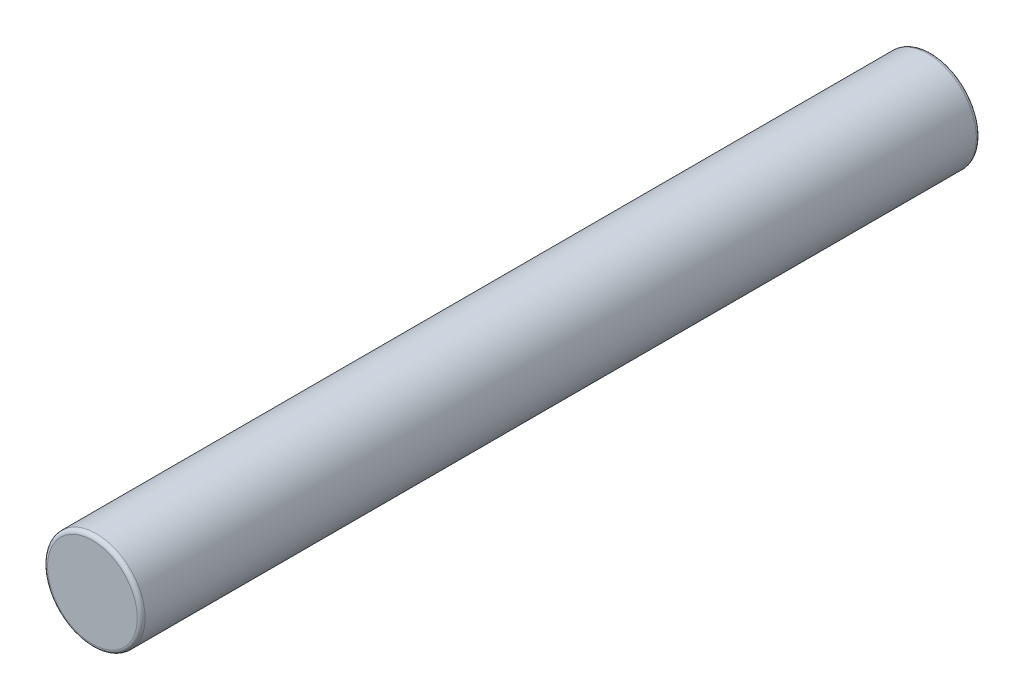
ISO-10303-21;
HEADER;
FILE_DESCRIPTION(('STEP AP214'),'2;1');
FILE_NAME('part.step','',(''),(''),'','','');
FILE_SCHEMA(('AUTOMOTIVE_DESIGN { 1 0 10303 214 1 1 1 1 }'));
ENDSEC;
DATA;
#1=APPLICATION_CONTEXT('core data for automotive mechanical design processes');
#2=APPLICATION_PROTOCOL_DEFINITION('international standard','automotive_design',2000,#1);
#3=PRODUCT_CONTEXT('',#1,'mechanical');
#4=PRODUCT('Part','Part','',(#3));
#5=PRODUCT_RELATED_PRODUCT_CATEGORY('part','',(#4));
#6=PRODUCT_DEFINITION_FORMATION('','',#4);
#7=PRODUCT_DEFINITION_CONTEXT('part definition',#1,'design');
#8=PRODUCT_DEFINITION('design','',#6,#7);
#9=PRODUCT_DEFINITION_SHAPE('','',#8);
#10=(LENGTH_UNIT() NAMED_UNIT(*) SI_UNIT(.MILLI.,.METRE.));
#11=(NAMED_UNIT(*) PLANE_ANGLE_UNIT() SI_UNIT($,.RADIAN.));
#12=(NAMED_UNIT(*) SI_UNIT($,.STERADIAN.) SOLID_ANGLE_UNIT());
#13=UNCERTAINTY_MEASURE_WITH_UNIT(LENGTH_MEASURE(1.E-05),#10,'distance_accuracy_value','');
#14=(GEOMETRIC_REPRESENTATION_CONTEXT(3) GLOBAL_UNCERTAINTY_ASSIGNED_CONTEXT((#13)) GLOBAL_UNIT_ASSIGNED_CONTEXT((#10,
#11,#12)) REPRESENTATION_CONTEXT('',''));
#15=CARTESIAN_POINT('',(0.,0.,0.));
#16=DIRECTION('',(0.,0.,1.));
#17=DIRECTION('',(1.,0.,0.));
#18=AXIS2_PLACEMENT_3D('',#15,#16,#17);
#19=CARTESIAN_POINT('',(0.,0.,21.5));
#20=DIRECTION('',(0.,0.,-1.));
#21=DIRECTION('',(-1.,0.,0.));
#22=AXIS2_PLACEMENT_3D('',#19,#20,#21);
#23=CYLINDRICAL_SURFACE('',#22,2.5);
#24=CARTESIAN_POINT('',(0.,0.,-21.3));
#25=DIRECTION('',(0.,0.,1.));
#26=DIRECTION('',(1.,0.,0.));
#27=AXIS2_PLACEMENT_3D('',#24,#25,#26);
#28=CIRCLE('',#27,2.5);
#29=CARTESIAN_POINT('',(2.5,0.,-21.3));
#30=VERTEX_POINT('',#29);
#31=EDGE_CURVE('E43',#30,#30,#28,.T.);
#32=ORIENTED_EDGE('',*,*,#31,.T.);
#33=EDGE_LOOP('',(#32));
#34=FACE_BOUND('',#33,.T.);
#35=CARTESIAN_POINT('',(0.,0.,21.3));
#36=DIRECTION('',(0.,0.,1.));
#37=DIRECTION('',(1.,0.,0.));
#38=AXIS2_PLACEMENT_3D('',#35,#36,#37);
#39=CIRCLE('',#38,2.5);
#40=CARTESIAN_POINT('',(2.5,0.,21.3));
#41=VERTEX_POINT('',#40);
#42=EDGE_CURVE('E47',#41,#41,#39,.F.);
#43=ORIENTED_EDGE('',*,*,#42,.T.);
#44=EDGE_LOOP('',(#43));
#45=FACE_BOUND('',#44,.T.);
#46=ADVANCED_FACE('F33',(#34,#45),#23,.T.);
#47=CARTESIAN_POINT('',(0.,0.,21.5));
#48=DIRECTION('',(0.,0.,1.));
#49=DIRECTION('',(1.,0.,0.));
#50=AXIS2_PLACEMENT_3D('',#47,#48,#49);
#51=PLANE('',#50);
#52=CARTESIAN_POINT('',(0.,0.,21.5));
#53=DIRECTION('',(0.,0.,1.));
#54=DIRECTION('',(1.,0.,0.));
#55=AXIS2_PLACEMENT_3D('',#52,#53,#54);
#56=CIRCLE('',#55,2.3);
#57=CARTESIAN_POINT('',(2.3,0.,21.5));
#58=VERTEX_POINT('',#57);
#59=EDGE_CURVE('E10',#58,#58,#56,.T.);
#60=ORIENTED_EDGE('',*,*,#59,.T.);
#61=EDGE_LOOP('',(#60));
#62=FACE_BOUND('',#61,.T.);
#63=ADVANCED_FACE('F66',(#62),#51,.T.);
#64=CARTESIAN_POINT('',(0.,0.,-21.5));
#65=DIRECTION('',(0.,0.,1.));
#66=DIRECTION('',(1.,0.,0.));
#67=AXIS2_PLACEMENT_3D('',#64,#65,#66);
#68=PLANE('',#67);
#69=CARTESIAN_POINT('',(0.,0.,-21.5));
#70=DIRECTION('',(0.,0.,1.));
#71=DIRECTION('',(1.,0.,0.));
#72=AXIS2_PLACEMENT_3D('',#69,#70,#71);
#73=CIRCLE('',#72,2.3);
#74=CARTESIAN_POINT('',(2.3,0.,-21.5));
#75=VERTEX_POINT('',#74);
#76=EDGE_CURVE('E39',#75,#75,#73,.F.);
#77=ORIENTED_EDGE('',*,*,#76,.T.);
#78=EDGE_LOOP('',(#77));
#79=FACE_BOUND('',#78,.T.);
#80=ADVANCED_FACE('F62',(#79),#68,.F.);
#81=CARTESIAN_POINT('',(0.,0.,-21.3));
#82=DIRECTION('',(0.,0.,1.));
#83=DIRECTION('',(1.,0.,0.));
#84=AXIS2_PLACEMENT_3D('',#81,#82,#83);
#85=TOROIDAL_SURFACE('',#84,2.3,0.2);
#86=ORIENTED_EDGE('',*,*,#76,.F.);
#87=EDGE_LOOP('',(#86));
#88=FACE_BOUND('',#87,.T.);
#89=ORIENTED_EDGE('',*,*,#31,.F.);
#90=EDGE_LOOP('',(#89));
#91=FACE_BOUND('',#90,.T.);
#92=ADVANCED_FACE('F57',(#88,#91),#85,.T.);
#93=CARTESIAN_POINT('',(0.,0.,21.3));
#94=DIRECTION('',(0.,0.,1.));
#95=DIRECTION('',(1.,0.,0.));
#96=AXIS2_PLACEMENT_3D('',#93,#94,#95);
#97=TOROIDAL_SURFACE('',#96,2.3,0.2);
#98=ORIENTED_EDGE('',*,*,#42,.F.);
#99=EDGE_LOOP('',(#98));
#100=FACE_BOUND('',#99,.T.);
#101=ORIENTED_EDGE('',*,*,#59,.F.);
#102=EDGE_LOOP('',(#101));
#103=FACE_BOUND('',#102,.T.);
#104=ADVANCED_FACE('F54',(#100,#103),#97,.T.);
#105=CLOSED_SHELL('',(#46,#63,#80,#92,#104));
#106=MANIFOLD_SOLID_BREP('B2',#105);
#107=ADVANCED_BREP_SHAPE_REPRESENTATION('',(#18,#106),#14);
#108=SHAPE_DEFINITION_REPRESENTATION(#9,#107);
ENDSEC;
END-ISO-10303-21;
